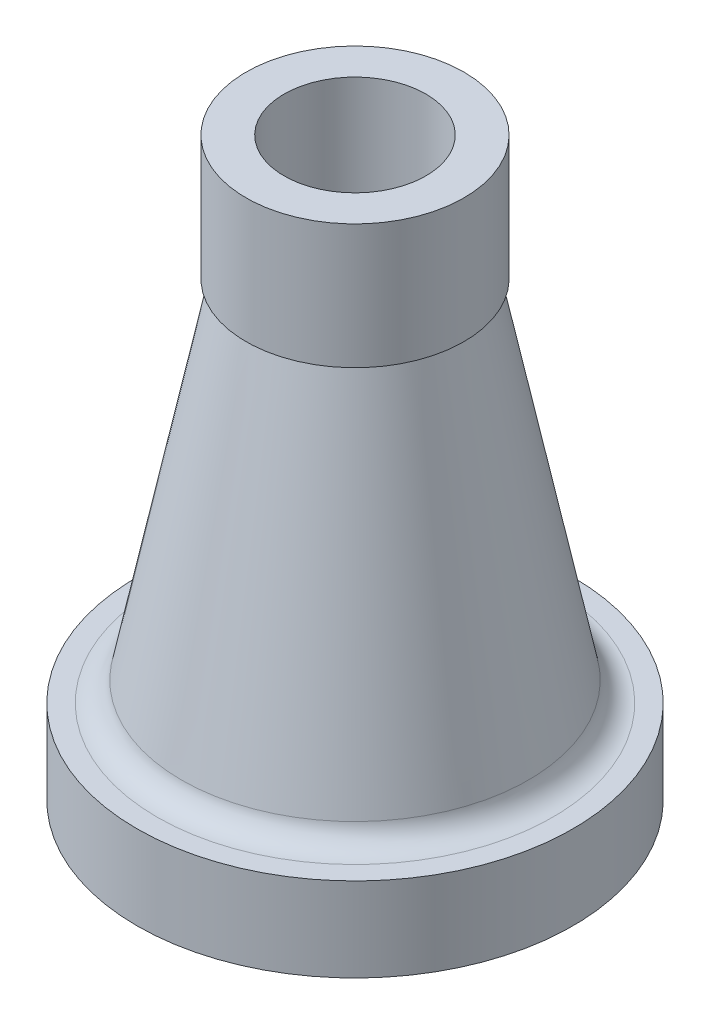
ISO-10303-21;
HEADER;
FILE_DESCRIPTION(('STEP AP214'),'2;1');
FILE_NAME('part.step','',(''),(''),'','','');
FILE_SCHEMA(('AUTOMOTIVE_DESIGN { 1 0 10303 214 1 1 1 1 }'));
ENDSEC;
DATA;
#1=APPLICATION_CONTEXT('core data for automotive mechanical design processes');
#2=APPLICATION_PROTOCOL_DEFINITION('international standard','automotive_design',2000,#1);
#3=PRODUCT_CONTEXT('',#1,'mechanical');
#4=PRODUCT('Part','Part','',(#3));
#5=PRODUCT_RELATED_PRODUCT_CATEGORY('part','',(#4));
#6=PRODUCT_DEFINITION_FORMATION('','',#4);
#7=PRODUCT_DEFINITION_CONTEXT('part definition',#1,'design');
#8=PRODUCT_DEFINITION('design','',#6,#7);
#9=PRODUCT_DEFINITION_SHAPE('','',#8);
#10=(LENGTH_UNIT() NAMED_UNIT(*) SI_UNIT(.MILLI.,.METRE.));
#11=(NAMED_UNIT(*) PLANE_ANGLE_UNIT() SI_UNIT($,.RADIAN.));
#12=(NAMED_UNIT(*) SI_UNIT($,.STERADIAN.) SOLID_ANGLE_UNIT());
#13=UNCERTAINTY_MEASURE_WITH_UNIT(LENGTH_MEASURE(1.E-05),#10,'distance_accuracy_value','');
#14=(GEOMETRIC_REPRESENTATION_CONTEXT(3) GLOBAL_UNCERTAINTY_ASSIGNED_CONTEXT((#13)) GLOBAL_UNIT_ASSIGNED_CONTEXT((#10,
#11,#12)) REPRESENTATION_CONTEXT('',''));
#15=CARTESIAN_POINT('',(0.,0.,0.));
#16=DIRECTION('',(0.,0.,1.));
#17=DIRECTION('',(1.,0.,0.));
#18=AXIS2_PLACEMENT_3D('',#15,#16,#17);
#19=CARTESIAN_POINT('',(-50.,0.,0.));
#20=DIRECTION('',(0.,1.,0.));
#21=DIRECTION('',(0.,0.,1.));
#22=AXIS2_PLACEMENT_3D('',#19,#20,#21);
#23=PLANE('',#22);
#24=CARTESIAN_POINT('',(0.,0.,0.));
#25=DIRECTION('',(0.,-1.,0.));
#26=DIRECTION('',(0.,0.,-1.));
#27=AXIS2_PLACEMENT_3D('',#24,#25,#26);
#28=CIRCLE('',#27,50.);
#29=CARTESIAN_POINT('',(0.,0.,-50.));
#30=VERTEX_POINT('',#29);
#31=EDGE_CURVE('E10',#30,#30,#28,.T.);
#32=ORIENTED_EDGE('',*,*,#31,.F.);
#33=EDGE_LOOP('',(#32));
#34=FACE_BOUND('',#33,.T.);
#35=CARTESIAN_POINT('',(0.,0.,0.));
#36=DIRECTION('',(0.,-1.,0.));
#37=DIRECTION('',(0.,0.,-1.));
#38=AXIS2_PLACEMENT_3D('',#35,#36,#37);
#39=CIRCLE('',#38,70.);
#40=CARTESIAN_POINT('',(0.,0.,-70.));
#41=VERTEX_POINT('',#40);
#42=EDGE_CURVE('E94',#41,#41,#39,.T.);
#43=ORIENTED_EDGE('',*,*,#42,.T.);
#44=EDGE_LOOP('',(#43));
#45=FACE_BOUND('',#44,.T.);
#46=ADVANCED_FACE('F43',(#34,#45),#23,.F.);
#47=CARTESIAN_POINT('',(0.,0.,0.));
#48=DIRECTION('',(0.,-1.,0.));
#49=DIRECTION('',(0.,0.,-1.));
#50=AXIS2_PLACEMENT_3D('',#47,#48,#49);
#51=CYLINDRICAL_SURFACE('',#50,50.);
#52=CARTESIAN_POINT('',(0.,8.,0.));
#53=DIRECTION('',(0.,-1.,0.));
#54=DIRECTION('',(0.,0.,-1.));
#55=AXIS2_PLACEMENT_3D('',#52,#53,#54);
#56=CIRCLE('',#55,50.);
#57=CARTESIAN_POINT('',(0.,8.,-50.));
#58=VERTEX_POINT('',#57);
#59=EDGE_CURVE('E50',#58,#58,#56,.T.);
#60=ORIENTED_EDGE('',*,*,#59,.F.);
#61=EDGE_LOOP('',(#60));
#62=FACE_BOUND('',#61,.T.);
#63=ORIENTED_EDGE('',*,*,#31,.T.);
#64=EDGE_LOOP('',(#63));
#65=FACE_BOUND('',#64,.T.);
#66=ADVANCED_FACE('F156',(#62,#65),#51,.F.);
#67=CARTESIAN_POINT('',(-47.5982432606525,8.,0.));
#68=DIRECTION('',(0.,1.,0.));
#69=DIRECTION('',(0.,0.,1.));
#70=AXIS2_PLACEMENT_3D('',#67,#68,#69);
#71=PLANE('',#70);
#72=CARTESIAN_POINT('',(0.,8.,0.));
#73=DIRECTION('',(0.,-1.,0.));
#74=DIRECTION('',(0.,0.,-1.));
#75=AXIS2_PLACEMENT_3D('',#72,#73,#74);
#76=CIRCLE('',#75,47.5982432606525);
#77=CARTESIAN_POINT('',(0.,8.,-47.5982432606525));
#78=VERTEX_POINT('',#77);
#79=EDGE_CURVE('E55',#78,#78,#76,.T.);
#80=ORIENTED_EDGE('',*,*,#79,.F.);
#81=EDGE_LOOP('',(#80));
#82=FACE_BOUND('',#81,.T.);
#83=ORIENTED_EDGE('',*,*,#59,.T.);
#84=EDGE_LOOP('',(#83));
#85=FACE_BOUND('',#84,.T.);
#86=ADVANCED_FACE('F151',(#82,#85),#71,.F.);
#87=CARTESIAN_POINT('',(0.,8.,0.));
#88=DIRECTION('',(0.,-1.,0.));
#89=DIRECTION('',(0.,0.,-1.));
#90=AXIS2_PLACEMENT_3D('',#87,#88,#89);
#91=CONICAL_SURFACE('',#90,47.5982432606525,0.200652877319886);
#92=CARTESIAN_POINT('',(0.,130.,0.));
#93=DIRECTION('',(0.,-1.,0.));
#94=DIRECTION('',(0.,0.,-1.));
#95=AXIS2_PLACEMENT_3D('',#92,#93,#94);
#96=CIRCLE('',#95,22.7846839386187);
#97=CARTESIAN_POINT('',(0.,130.,-22.7846839386187));
#98=VERTEX_POINT('',#97);
#99=EDGE_CURVE('E60',#98,#98,#96,.T.);
#100=ORIENTED_EDGE('',*,*,#99,.F.);
#101=EDGE_LOOP('',(#100));
#102=FACE_BOUND('',#101,.T.);
#103=ORIENTED_EDGE('',*,*,#79,.T.);
#104=EDGE_LOOP('',(#103));
#105=FACE_BOUND('',#104,.T.);
#106=ADVANCED_FACE('F145',(#102,#105),#91,.F.);
#107=CARTESIAN_POINT('',(0.,0.,0.));
#108=DIRECTION('',(0.,-1.,0.));
#109=DIRECTION('',(0.,0.,-1.));
#110=AXIS2_PLACEMENT_3D('',#107,#108,#109);
#111=CYLINDRICAL_SURFACE('',#110,22.7846839386187);
#112=CARTESIAN_POINT('',(0.,185.,0.));
#113=DIRECTION('',(0.,-1.,0.));
#114=DIRECTION('',(0.,0.,-1.));
#115=AXIS2_PLACEMENT_3D('',#112,#113,#114);
#116=CIRCLE('',#115,22.7846839386187);
#117=CARTESIAN_POINT('',(0.,185.,-22.7846839386187));
#118=VERTEX_POINT('',#117);
#119=EDGE_CURVE('E66',#118,#118,#116,.T.);
#120=ORIENTED_EDGE('',*,*,#119,.F.);
#121=EDGE_LOOP('',(#120));
#122=FACE_BOUND('',#121,.T.);
#123=ORIENTED_EDGE('',*,*,#99,.T.);
#124=EDGE_LOOP('',(#123));
#125=FACE_BOUND('',#124,.T.);
#126=ADVANCED_FACE('F139',(#122,#125),#111,.F.);
#127=CARTESIAN_POINT('',(-35.,185.,0.));
#128=DIRECTION('',(0.,-1.,0.));
#129=DIRECTION('',(0.,0.,-1.));
#130=AXIS2_PLACEMENT_3D('',#127,#128,#129);
#131=PLANE('',#130);
#132=CARTESIAN_POINT('',(0.,185.,0.));
#133=DIRECTION('',(0.,-1.,0.));
#134=DIRECTION('',(0.,0.,-1.));
#135=AXIS2_PLACEMENT_3D('',#132,#133,#134);
#136=CIRCLE('',#135,35.);
#137=CARTESIAN_POINT('',(0.,185.,-35.));
#138=VERTEX_POINT('',#137);
#139=EDGE_CURVE('E70',#138,#138,#136,.T.);
#140=ORIENTED_EDGE('',*,*,#139,.F.);
#141=EDGE_LOOP('',(#140));
#142=FACE_BOUND('',#141,.T.);
#143=ORIENTED_EDGE('',*,*,#119,.T.);
#144=EDGE_LOOP('',(#143));
#145=FACE_BOUND('',#144,.T.);
#146=ADVANCED_FACE('F133',(#142,#145),#131,.F.);
#147=CARTESIAN_POINT('',(0.,0.,0.));
#148=DIRECTION('',(0.,-1.,0.));
#149=DIRECTION('',(0.,0.,-1.));
#150=AXIS2_PLACEMENT_3D('',#147,#148,#149);
#151=CYLINDRICAL_SURFACE('',#150,35.);
#152=CARTESIAN_POINT('',(0.,145.,0.));
#153=DIRECTION('',(0.,-1.,0.));
#154=DIRECTION('',(0.,0.,-1.));
#155=AXIS2_PLACEMENT_3D('',#152,#153,#154);
#156=CIRCLE('',#155,35.);
#157=CARTESIAN_POINT('',(0.,145.,-35.));
#158=VERTEX_POINT('',#157);
#159=EDGE_CURVE('E74',#158,#158,#156,.T.);
#160=ORIENTED_EDGE('',*,*,#159,.F.);
#161=EDGE_LOOP('',(#160));
#162=FACE_BOUND('',#161,.T.);
#163=ORIENTED_EDGE('',*,*,#139,.T.);
#164=EDGE_LOOP('',(#163));
#165=FACE_BOUND('',#164,.T.);
#166=ADVANCED_FACE('F127',(#162,#165),#151,.T.);
#167=CARTESIAN_POINT('',(-33.,145.,0.));
#168=DIRECTION('',(0.,1.,0.));
#169=DIRECTION('',(0.,0.,1.));
#170=AXIS2_PLACEMENT_3D('',#167,#168,#169);
#171=PLANE('',#170);
#172=CARTESIAN_POINT('',(0.,145.,0.));
#173=DIRECTION('',(0.,-1.,0.));
#174=DIRECTION('',(0.,0.,-1.));
#175=AXIS2_PLACEMENT_3D('',#172,#173,#174);
#176=CIRCLE('',#175,33.);
#177=CARTESIAN_POINT('',(0.,145.,-33.));
#178=VERTEX_POINT('',#177);
#179=EDGE_CURVE('E78',#178,#178,#176,.T.);
#180=ORIENTED_EDGE('',*,*,#179,.F.);
#181=EDGE_LOOP('',(#180));
#182=FACE_BOUND('',#181,.T.);
#183=ORIENTED_EDGE('',*,*,#159,.T.);
#184=EDGE_LOOP('',(#183));
#185=FACE_BOUND('',#184,.T.);
#186=ADVANCED_FACE('F121',(#182,#185),#171,.F.);
#187=CARTESIAN_POINT('',(0.,145.,0.));
#188=DIRECTION('',(0.,-1.,0.));
#189=DIRECTION('',(0.,0.,-1.));
#190=AXIS2_PLACEMENT_3D('',#187,#188,#189);
#191=CONICAL_SURFACE('',#190,33.,0.200652877319887);
#192=CARTESIAN_POINT('',(0.,33.4055267868082,0.));
#193=DIRECTION('',(0.,-1.,0.));
#194=DIRECTION('',(0.,0.,-1.));
#195=AXIS2_PLACEMENT_3D('',#192,#193,#194);
#196=CIRCLE('',#195,55.6971809925136);
#197=CARTESIAN_POINT('',(0.,33.4055267868082,-55.6971809925136));
#198=VERTEX_POINT('',#197);
#199=EDGE_CURVE('E82',#198,#198,#196,.T.);
#200=ORIENTED_EDGE('',*,*,#199,.F.);
#201=EDGE_LOOP('',(#200));
#202=FACE_BOUND('',#201,.T.);
#203=ORIENTED_EDGE('',*,*,#179,.T.);
#204=EDGE_LOOP('',(#203));
#205=FACE_BOUND('',#204,.T.);
#206=ADVANCED_FACE('F115',(#202,#205),#191,.T.);
#207=CARTESIAN_POINT('',(0.,35.,0.));
#208=DIRECTION('',(0.,-1.,0.));
#209=DIRECTION('',(0.,0.,-1.));
#210=AXIS2_PLACEMENT_3D('',#207,#208,#209);
#211=TOROIDAL_SURFACE('',#210,63.5366742907067,8.);
#212=CARTESIAN_POINT('',(0.,27.,0.));
#213=DIRECTION('',(0.,-1.,0.));
#214=DIRECTION('',(0.,0.,-1.));
#215=AXIS2_PLACEMENT_3D('',#212,#213,#214);
#216=CIRCLE('',#215,63.5366742907067);
#217=CARTESIAN_POINT('',(0.,27.,-63.5366742907067));
#218=VERTEX_POINT('',#217);
#219=EDGE_CURVE('E86',#218,#218,#216,.T.);
#220=ORIENTED_EDGE('',*,*,#219,.F.);
#221=EDGE_LOOP('',(#220));
#222=FACE_BOUND('',#221,.T.);
#223=ORIENTED_EDGE('',*,*,#199,.T.);
#224=EDGE_LOOP('',(#223));
#225=FACE_BOUND('',#224,.T.);
#226=ADVANCED_FACE('F109',(#222,#225),#211,.F.);
#227=CARTESIAN_POINT('',(-70.,27.,0.));
#228=DIRECTION('',(0.,-1.,0.));
#229=DIRECTION('',(0.,0.,-1.));
#230=AXIS2_PLACEMENT_3D('',#227,#228,#229);
#231=PLANE('',#230);
#232=CARTESIAN_POINT('',(0.,27.,0.));
#233=DIRECTION('',(0.,-1.,0.));
#234=DIRECTION('',(0.,0.,-1.));
#235=AXIS2_PLACEMENT_3D('',#232,#233,#234);
#236=CIRCLE('',#235,70.);
#237=CARTESIAN_POINT('',(0.,27.,-70.));
#238=VERTEX_POINT('',#237);
#239=EDGE_CURVE('E90',#238,#238,#236,.T.);
#240=ORIENTED_EDGE('',*,*,#239,.F.);
#241=EDGE_LOOP('',(#240));
#242=FACE_BOUND('',#241,.T.);
#243=ORIENTED_EDGE('',*,*,#219,.T.);
#244=EDGE_LOOP('',(#243));
#245=FACE_BOUND('',#244,.T.);
#246=ADVANCED_FACE('F103',(#242,#245),#231,.F.);
#247=CARTESIAN_POINT('',(0.,0.,0.));
#248=DIRECTION('',(0.,-1.,0.));
#249=DIRECTION('',(0.,0.,-1.));
#250=AXIS2_PLACEMENT_3D('',#247,#248,#249);
#251=CYLINDRICAL_SURFACE('',#250,70.);
#252=ORIENTED_EDGE('',*,*,#42,.F.);
#253=EDGE_LOOP('',(#252));
#254=FACE_BOUND('',#253,.T.);
#255=ORIENTED_EDGE('',*,*,#239,.T.);
#256=EDGE_LOOP('',(#255));
#257=FACE_BOUND('',#256,.T.);
#258=ADVANCED_FACE('F100',(#254,#257),#251,.T.);
#259=CLOSED_SHELL('',(#46,#66,#86,#106,#126,#146,#166,#186,#206,#226,#246,#258));
#260=MANIFOLD_SOLID_BREP('B2',#259);
#261=ADVANCED_BREP_SHAPE_REPRESENTATION('',(#18,#260),#14);
#262=SHAPE_DEFINITION_REPRESENTATION(#9,#261);
ENDSEC;
END-ISO-10303-21;
